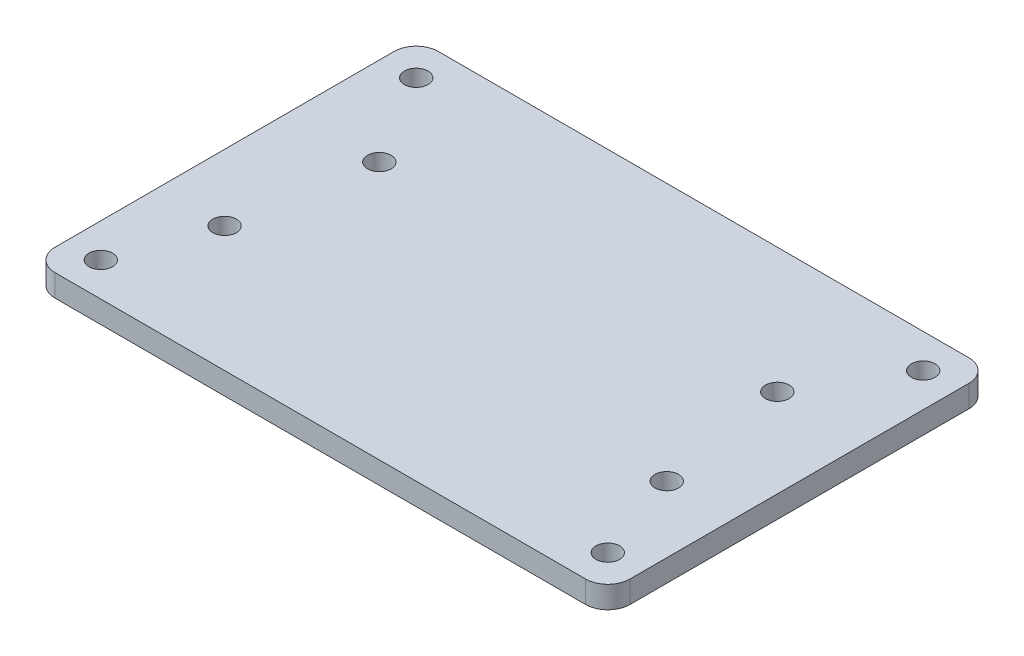
ISO-10303-21;
HEADER;
FILE_DESCRIPTION(('STEP AP214'),'2;1');
FILE_NAME('part.step','',(''),(''),'','','');
FILE_SCHEMA(('AUTOMOTIVE_DESIGN { 1 0 10303 214 1 1 1 1 }'));
ENDSEC;
DATA;
#1=APPLICATION_CONTEXT('core data for automotive mechanical design processes');
#2=APPLICATION_PROTOCOL_DEFINITION('international standard','automotive_design',2000,#1);
#3=PRODUCT_CONTEXT('',#1,'mechanical');
#4=PRODUCT('Part','Part','',(#3));
#5=PRODUCT_RELATED_PRODUCT_CATEGORY('part','',(#4));
#6=PRODUCT_DEFINITION_FORMATION('','',#4);
#7=PRODUCT_DEFINITION_CONTEXT('part definition',#1,'design');
#8=PRODUCT_DEFINITION('design','',#6,#7);
#9=PRODUCT_DEFINITION_SHAPE('','',#8);
#10=(LENGTH_UNIT() NAMED_UNIT(*) SI_UNIT(.MILLI.,.METRE.));
#11=(NAMED_UNIT(*) PLANE_ANGLE_UNIT() SI_UNIT($,.RADIAN.));
#12=(NAMED_UNIT(*) SI_UNIT($,.STERADIAN.) SOLID_ANGLE_UNIT());
#13=UNCERTAINTY_MEASURE_WITH_UNIT(LENGTH_MEASURE(1.E-05),#10,'distance_accuracy_value','');
#14=(GEOMETRIC_REPRESENTATION_CONTEXT(3) GLOBAL_UNCERTAINTY_ASSIGNED_CONTEXT((#13)) GLOBAL_UNIT_ASSIGNED_CONTEXT((#10,
#11,#12)) REPRESENTATION_CONTEXT('',''));
#15=CARTESIAN_POINT('',(0.,0.,0.));
#16=DIRECTION('',(0.,0.,1.));
#17=DIRECTION('',(1.,0.,0.));
#18=AXIS2_PLACEMENT_3D('',#15,#16,#17);
#19=CARTESIAN_POINT('',(39.,3.,26.));
#20=DIRECTION('',(-1.,0.,0.));
#21=DIRECTION('',(0.,0.,1.));
#22=AXIS2_PLACEMENT_3D('',#19,#20,#21);
#23=PLANE('',#22);
#24=DIRECTION('',(0.,0.,-1.));
#25=VECTOR('',#24,1.);
#26=CARTESIAN_POINT('',(39.,3.,26.));
#27=LINE('',#26,#25);
#28=CARTESIAN_POINT('',(39.,3.,23.));
#29=VERTEX_POINT('',#28);
#30=CARTESIAN_POINT('',(39.,3.,-23.));
#31=VERTEX_POINT('',#30);
#32=EDGE_CURVE('E133',#29,#31,#27,.T.);
#33=ORIENTED_EDGE('',*,*,#32,.F.);
#34=DIRECTION('',(0.,-1.,0.));
#35=VECTOR('',#34,1.);
#36=CARTESIAN_POINT('',(39.,3.,23.));
#37=LINE('',#36,#35);
#38=CARTESIAN_POINT('',(39.,0.,23.));
#39=VERTEX_POINT('',#38);
#40=EDGE_CURVE('E11',#29,#39,#37,.T.);
#41=ORIENTED_EDGE('',*,*,#40,.T.);
#42=DIRECTION('',(0.,0.,-1.));
#43=VECTOR('',#42,1.);
#44=CARTESIAN_POINT('',(39.,0.,26.));
#45=LINE('',#44,#43);
#46=CARTESIAN_POINT('',(39.,0.,-23.));
#47=VERTEX_POINT('',#46);
#48=EDGE_CURVE('E135',#39,#47,#45,.T.);
#49=ORIENTED_EDGE('',*,*,#48,.T.);
#50=DIRECTION('',(0.,-1.,0.));
#51=VECTOR('',#50,1.);
#52=CARTESIAN_POINT('',(39.,3.,-23.));
#53=LINE('',#52,#51);
#54=EDGE_CURVE('E46',#47,#31,#53,.F.);
#55=ORIENTED_EDGE('',*,*,#54,.T.);
#56=EDGE_LOOP('',(#33,#41,#49,#55));
#57=FACE_BOUND('',#56,.T.);
#58=ADVANCED_FACE('F38',(#57),#23,.F.);
#59=CARTESIAN_POINT('',(-39.,3.,-26.));
#60=DIRECTION('',(0.,0.,1.));
#61=DIRECTION('',(1.,0.,0.));
#62=AXIS2_PLACEMENT_3D('',#59,#60,#61);
#63=PLANE('',#62);
#64=DIRECTION('',(-1.,0.,0.));
#65=VECTOR('',#64,1.);
#66=CARTESIAN_POINT('',(-39.,0.,-26.));
#67=LINE('',#66,#65);
#68=CARTESIAN_POINT('',(36.,0.,-26.));
#69=VERTEX_POINT('',#68);
#70=CARTESIAN_POINT('',(-36.,0.,-26.));
#71=VERTEX_POINT('',#70);
#72=EDGE_CURVE('E131',#69,#71,#67,.T.);
#73=ORIENTED_EDGE('',*,*,#72,.T.);
#74=DIRECTION('',(0.,-1.,0.));
#75=VECTOR('',#74,1.);
#76=CARTESIAN_POINT('',(-36.,3.,-26.));
#77=LINE('',#76,#75);
#78=CARTESIAN_POINT('',(-36.,3.,-26.));
#79=VERTEX_POINT('',#78);
#80=EDGE_CURVE('E110',#71,#79,#77,.F.);
#81=ORIENTED_EDGE('',*,*,#80,.T.);
#82=DIRECTION('',(-1.,0.,0.));
#83=VECTOR('',#82,1.);
#84=CARTESIAN_POINT('',(-39.,3.,-26.));
#85=LINE('',#84,#83);
#86=CARTESIAN_POINT('',(36.,3.,-26.));
#87=VERTEX_POINT('',#86);
#88=EDGE_CURVE('E171',#87,#79,#85,.T.);
#89=ORIENTED_EDGE('',*,*,#88,.F.);
#90=DIRECTION('',(0.,-1.,0.));
#91=VECTOR('',#90,1.);
#92=CARTESIAN_POINT('',(36.,3.,-26.));
#93=LINE('',#92,#91);
#94=EDGE_CURVE('E115',#87,#69,#93,.T.);
#95=ORIENTED_EDGE('',*,*,#94,.T.);
#96=EDGE_LOOP('',(#73,#81,#89,#95));
#97=FACE_BOUND('',#96,.T.);
#98=ADVANCED_FACE('F175',(#97),#63,.F.);
#99=CARTESIAN_POINT('',(-39.,3.,26.));
#100=DIRECTION('',(1.,0.,0.));
#101=DIRECTION('',(0.,0.,-1.));
#102=AXIS2_PLACEMENT_3D('',#99,#100,#101);
#103=PLANE('',#102);
#104=DIRECTION('',(0.,0.,1.));
#105=VECTOR('',#104,1.);
#106=CARTESIAN_POINT('',(-39.,3.,26.));
#107=LINE('',#106,#105);
#108=CARTESIAN_POINT('',(-39.,3.,-23.));
#109=VERTEX_POINT('',#108);
#110=CARTESIAN_POINT('',(-39.,3.,23.));
#111=VERTEX_POINT('',#110);
#112=EDGE_CURVE('E124',#109,#111,#107,.T.);
#113=ORIENTED_EDGE('',*,*,#112,.F.);
#114=DIRECTION('',(0.,-1.,0.));
#115=VECTOR('',#114,1.);
#116=CARTESIAN_POINT('',(-39.,3.,-23.));
#117=LINE('',#116,#115);
#118=CARTESIAN_POINT('',(-39.,0.,-23.));
#119=VERTEX_POINT('',#118);
#120=EDGE_CURVE('E109',#109,#119,#117,.T.);
#121=ORIENTED_EDGE('',*,*,#120,.T.);
#122=DIRECTION('',(0.,0.,1.));
#123=VECTOR('',#122,1.);
#124=CARTESIAN_POINT('',(-39.,0.,26.));
#125=LINE('',#124,#123);
#126=CARTESIAN_POINT('',(-39.,0.,23.));
#127=VERTEX_POINT('',#126);
#128=EDGE_CURVE('E122',#119,#127,#125,.T.);
#129=ORIENTED_EDGE('',*,*,#128,.T.);
#130=DIRECTION('',(0.,-1.,0.));
#131=VECTOR('',#130,1.);
#132=CARTESIAN_POINT('',(-39.,3.,23.));
#133=LINE('',#132,#131);
#134=EDGE_CURVE('E126',#127,#111,#133,.F.);
#135=ORIENTED_EDGE('',*,*,#134,.T.);
#136=EDGE_LOOP('',(#113,#121,#129,#135));
#137=FACE_BOUND('',#136,.T.);
#138=ADVANCED_FACE('F121',(#137),#103,.F.);
#139=CARTESIAN_POINT('',(-39.,3.,26.));
#140=DIRECTION('',(0.,0.,-1.));
#141=DIRECTION('',(-1.,0.,0.));
#142=AXIS2_PLACEMENT_3D('',#139,#140,#141);
#143=PLANE('',#142);
#144=DIRECTION('',(1.,0.,0.));
#145=VECTOR('',#144,1.);
#146=CARTESIAN_POINT('',(-39.,3.,26.));
#147=LINE('',#146,#145);
#148=CARTESIAN_POINT('',(-36.,3.,26.));
#149=VERTEX_POINT('',#148);
#150=CARTESIAN_POINT('',(36.,3.,26.));
#151=VERTEX_POINT('',#150);
#152=EDGE_CURVE('E139',#149,#151,#147,.T.);
#153=ORIENTED_EDGE('',*,*,#152,.F.);
#154=DIRECTION('',(0.,-1.,0.));
#155=VECTOR('',#154,1.);
#156=CARTESIAN_POINT('',(-36.,3.,26.));
#157=LINE('',#156,#155);
#158=CARTESIAN_POINT('',(-36.,0.,26.));
#159=VERTEX_POINT('',#158);
#160=EDGE_CURVE('E156',#149,#159,#157,.T.);
#161=ORIENTED_EDGE('',*,*,#160,.T.);
#162=DIRECTION('',(1.,0.,0.));
#163=VECTOR('',#162,1.);
#164=CARTESIAN_POINT('',(-39.,0.,26.));
#165=LINE('',#164,#163);
#166=CARTESIAN_POINT('',(36.,0.,26.));
#167=VERTEX_POINT('',#166);
#168=EDGE_CURVE('E130',#159,#167,#165,.T.);
#169=ORIENTED_EDGE('',*,*,#168,.T.);
#170=DIRECTION('',(0.,-1.,0.));
#171=VECTOR('',#170,1.);
#172=CARTESIAN_POINT('',(36.,3.,26.));
#173=LINE('',#172,#171);
#174=EDGE_CURVE('E53',#167,#151,#173,.F.);
#175=ORIENTED_EDGE('',*,*,#174,.T.);
#176=EDGE_LOOP('',(#153,#161,#169,#175));
#177=FACE_BOUND('',#176,.T.);
#178=ADVANCED_FACE('F241',(#177),#143,.F.);
#179=CARTESIAN_POINT('',(0.,3.,0.));
#180=DIRECTION('',(0.,-1.,0.));
#181=DIRECTION('',(0.,0.,-1.));
#182=AXIS2_PLACEMENT_3D('',#179,#180,#181);
#183=PLANE('',#182);
#184=CARTESIAN_POINT('',(-30.,3.,9.00000000000002));
#185=DIRECTION('',(0.,1.,0.));
#186=DIRECTION('',(0.,0.,1.));
#187=AXIS2_PLACEMENT_3D('',#184,#185,#186);
#188=CIRCLE('',#187,1.6);
#189=CARTESIAN_POINT('',(-30.,3.,10.6));
#190=VERTEX_POINT('',#189);
#191=EDGE_CURVE('E211',#190,#190,#188,.T.);
#192=ORIENTED_EDGE('',*,*,#191,.F.);
#193=EDGE_LOOP('',(#192));
#194=FACE_BOUND('',#193,.T.);
#195=CARTESIAN_POINT('',(30.,3.,9.));
#196=DIRECTION('',(0.,1.,0.));
#197=DIRECTION('',(0.,0.,1.));
#198=AXIS2_PLACEMENT_3D('',#195,#196,#197);
#199=CIRCLE('',#198,1.6);
#200=CARTESIAN_POINT('',(30.,3.,10.6));
#201=VERTEX_POINT('',#200);
#202=EDGE_CURVE('E217',#201,#201,#199,.T.);
#203=ORIENTED_EDGE('',*,*,#202,.F.);
#204=EDGE_LOOP('',(#203));
#205=FACE_BOUND('',#204,.T.);
#206=CARTESIAN_POINT('',(27.,3.,-8.99999999999999));
#207=DIRECTION('',(0.,1.,0.));
#208=DIRECTION('',(0.,0.,1.));
#209=AXIS2_PLACEMENT_3D('',#206,#207,#208);
#210=CIRCLE('',#209,1.6);
#211=CARTESIAN_POINT('',(27.,3.,-7.4));
#212=VERTEX_POINT('',#211);
#213=EDGE_CURVE('E223',#212,#212,#210,.T.);
#214=ORIENTED_EDGE('',*,*,#213,.F.);
#215=EDGE_LOOP('',(#214));
#216=FACE_BOUND('',#215,.T.);
#217=CARTESIAN_POINT('',(-27.,3.,-8.99999999999999));
#218=DIRECTION('',(0.,1.,0.));
#219=DIRECTION('',(0.,0.,1.));
#220=AXIS2_PLACEMENT_3D('',#217,#218,#219);
#221=CIRCLE('',#220,1.60000000000001);
#222=CARTESIAN_POINT('',(-27.,3.,-7.39999999999998));
#223=VERTEX_POINT('',#222);
#224=EDGE_CURVE('E205',#223,#223,#221,.T.);
#225=ORIENTED_EDGE('',*,*,#224,.F.);
#226=EDGE_LOOP('',(#225));
#227=FACE_BOUND('',#226,.T.);
#228=CARTESIAN_POINT('',(-34.4,3.,21.4));
#229=DIRECTION('',(0.,1.,0.));
#230=DIRECTION('',(0.,0.,1.));
#231=AXIS2_PLACEMENT_3D('',#228,#229,#230);
#232=CIRCLE('',#231,1.6);
#233=CARTESIAN_POINT('',(-34.4,3.,23.));
#234=VERTEX_POINT('',#233);
#235=EDGE_CURVE('E190',#234,#234,#232,.T.);
#236=ORIENTED_EDGE('',*,*,#235,.F.);
#237=EDGE_LOOP('',(#236));
#238=FACE_BOUND('',#237,.T.);
#239=CARTESIAN_POINT('',(34.4,3.,21.4));
#240=DIRECTION('',(0.,1.,0.));
#241=DIRECTION('',(0.,0.,1.));
#242=AXIS2_PLACEMENT_3D('',#239,#240,#241);
#243=CIRCLE('',#242,1.6);
#244=CARTESIAN_POINT('',(34.4,3.,23.));
#245=VERTEX_POINT('',#244);
#246=EDGE_CURVE('E197',#245,#245,#243,.T.);
#247=ORIENTED_EDGE('',*,*,#246,.F.);
#248=EDGE_LOOP('',(#247));
#249=FACE_BOUND('',#248,.T.);
#250=CARTESIAN_POINT('',(34.4,3.,-21.4));
#251=DIRECTION('',(0.,1.,0.));
#252=DIRECTION('',(0.,0.,1.));
#253=AXIS2_PLACEMENT_3D('',#250,#251,#252);
#254=CIRCLE('',#253,1.6);
#255=CARTESIAN_POINT('',(34.4,3.,-19.8));
#256=VERTEX_POINT('',#255);
#257=EDGE_CURVE('E185',#256,#256,#254,.T.);
#258=ORIENTED_EDGE('',*,*,#257,.F.);
#259=EDGE_LOOP('',(#258));
#260=FACE_BOUND('',#259,.T.);
#261=CARTESIAN_POINT('',(-34.4,3.,-21.4));
#262=DIRECTION('',(0.,1.,0.));
#263=DIRECTION('',(0.,0.,1.));
#264=AXIS2_PLACEMENT_3D('',#261,#262,#263);
#265=CIRCLE('',#264,1.6);
#266=CARTESIAN_POINT('',(-34.4,3.,-19.8));
#267=VERTEX_POINT('',#266);
#268=EDGE_CURVE('E178',#267,#267,#265,.T.);
#269=ORIENTED_EDGE('',*,*,#268,.F.);
#270=EDGE_LOOP('',(#269));
#271=FACE_BOUND('',#270,.T.);
#272=ORIENTED_EDGE('',*,*,#88,.T.);
#273=CARTESIAN_POINT('',(-36.,3.,-23.));
#274=DIRECTION('',(0.,-1.,0.));
#275=DIRECTION('',(0.,0.,-1.));
#276=AXIS2_PLACEMENT_3D('',#273,#274,#275);
#277=CIRCLE('',#276,3.);
#278=EDGE_CURVE('E153',#79,#109,#277,.F.);
#279=ORIENTED_EDGE('',*,*,#278,.T.);
#280=ORIENTED_EDGE('',*,*,#112,.T.);
#281=CARTESIAN_POINT('',(-36.,3.,23.));
#282=DIRECTION('',(0.,-1.,0.));
#283=DIRECTION('',(0.,0.,-1.));
#284=AXIS2_PLACEMENT_3D('',#281,#282,#283);
#285=CIRCLE('',#284,3.);
#286=EDGE_CURVE('E60',#111,#149,#285,.F.);
#287=ORIENTED_EDGE('',*,*,#286,.T.);
#288=ORIENTED_EDGE('',*,*,#152,.T.);
#289=CARTESIAN_POINT('',(36.,3.,23.));
#290=DIRECTION('',(0.,-1.,0.));
#291=DIRECTION('',(0.,0.,-1.));
#292=AXIS2_PLACEMENT_3D('',#289,#290,#291);
#293=CIRCLE('',#292,3.);
#294=EDGE_CURVE('E150',#151,#29,#293,.F.);
#295=ORIENTED_EDGE('',*,*,#294,.T.);
#296=ORIENTED_EDGE('',*,*,#32,.T.);
#297=CARTESIAN_POINT('',(36.,3.,-23.));
#298=DIRECTION('',(0.,-1.,0.));
#299=DIRECTION('',(0.,0.,-1.));
#300=AXIS2_PLACEMENT_3D('',#297,#298,#299);
#301=CIRCLE('',#300,3.);
#302=EDGE_CURVE('E148',#31,#87,#301,.F.);
#303=ORIENTED_EDGE('',*,*,#302,.T.);
#304=EDGE_LOOP('',(#272,#279,#280,#287,#288,#295,#296,#303));
#305=FACE_BOUND('',#304,.T.);
#306=ADVANCED_FACE('F168',(#194,#205,#216,#227,#238,#249,#260,#271,#305),#183,.F.);
#307=CARTESIAN_POINT('',(0.,0.,0.));
#308=DIRECTION('',(0.,-1.,0.));
#309=DIRECTION('',(0.,0.,-1.));
#310=AXIS2_PLACEMENT_3D('',#307,#308,#309);
#311=PLANE('',#310);
#312=CARTESIAN_POINT('',(-30.,0.,9.00000000000002));
#313=DIRECTION('',(0.,1.,0.));
#314=DIRECTION('',(0.,0.,1.));
#315=AXIS2_PLACEMENT_3D('',#312,#313,#314);
#316=CIRCLE('',#315,1.6);
#317=CARTESIAN_POINT('',(-30.,0.,10.6));
#318=VERTEX_POINT('',#317);
#319=EDGE_CURVE('E214',#318,#318,#316,.T.);
#320=ORIENTED_EDGE('',*,*,#319,.T.);
#321=EDGE_LOOP('',(#320));
#322=FACE_BOUND('',#321,.T.);
#323=CARTESIAN_POINT('',(30.,0.,9.));
#324=DIRECTION('',(0.,1.,0.));
#325=DIRECTION('',(0.,0.,1.));
#326=AXIS2_PLACEMENT_3D('',#323,#324,#325);
#327=CIRCLE('',#326,1.6);
#328=CARTESIAN_POINT('',(30.,0.,10.6));
#329=VERTEX_POINT('',#328);
#330=EDGE_CURVE('E220',#329,#329,#327,.T.);
#331=ORIENTED_EDGE('',*,*,#330,.T.);
#332=EDGE_LOOP('',(#331));
#333=FACE_BOUND('',#332,.T.);
#334=CARTESIAN_POINT('',(27.,0.,-8.99999999999999));
#335=DIRECTION('',(0.,1.,0.));
#336=DIRECTION('',(0.,0.,1.));
#337=AXIS2_PLACEMENT_3D('',#334,#335,#336);
#338=CIRCLE('',#337,1.6);
#339=CARTESIAN_POINT('',(27.,0.,-7.4));
#340=VERTEX_POINT('',#339);
#341=EDGE_CURVE('E208',#340,#340,#338,.T.);
#342=ORIENTED_EDGE('',*,*,#341,.T.);
#343=EDGE_LOOP('',(#342));
#344=FACE_BOUND('',#343,.T.);
#345=CARTESIAN_POINT('',(-27.,0.,-8.99999999999999));
#346=DIRECTION('',(0.,1.,0.));
#347=DIRECTION('',(0.,0.,1.));
#348=AXIS2_PLACEMENT_3D('',#345,#346,#347);
#349=CIRCLE('',#348,1.60000000000001);
#350=CARTESIAN_POINT('',(-27.,0.,-7.39999999999998));
#351=VERTEX_POINT('',#350);
#352=EDGE_CURVE('E191',#351,#351,#349,.T.);
#353=ORIENTED_EDGE('',*,*,#352,.T.);
#354=EDGE_LOOP('',(#353));
#355=FACE_BOUND('',#354,.T.);
#356=CARTESIAN_POINT('',(-34.4,0.,21.4));
#357=DIRECTION('',(0.,1.,0.));
#358=DIRECTION('',(0.,0.,1.));
#359=AXIS2_PLACEMENT_3D('',#356,#357,#358);
#360=CIRCLE('',#359,1.6);
#361=CARTESIAN_POINT('',(-34.4,0.,23.));
#362=VERTEX_POINT('',#361);
#363=EDGE_CURVE('E187',#362,#362,#360,.T.);
#364=ORIENTED_EDGE('',*,*,#363,.T.);
#365=EDGE_LOOP('',(#364));
#366=FACE_BOUND('',#365,.T.);
#367=CARTESIAN_POINT('',(34.4,0.,21.4));
#368=DIRECTION('',(0.,1.,0.));
#369=DIRECTION('',(0.,0.,1.));
#370=AXIS2_PLACEMENT_3D('',#367,#368,#369);
#371=CIRCLE('',#370,1.6);
#372=CARTESIAN_POINT('',(34.4,0.,23.));
#373=VERTEX_POINT('',#372);
#374=EDGE_CURVE('E194',#373,#373,#371,.T.);
#375=ORIENTED_EDGE('',*,*,#374,.T.);
#376=EDGE_LOOP('',(#375));
#377=FACE_BOUND('',#376,.T.);
#378=CARTESIAN_POINT('',(34.4,0.,-21.4));
#379=DIRECTION('',(0.,1.,0.));
#380=DIRECTION('',(0.,0.,1.));
#381=AXIS2_PLACEMENT_3D('',#378,#379,#380);
#382=CIRCLE('',#381,1.6);
#383=CARTESIAN_POINT('',(34.4,0.,-19.8));
#384=VERTEX_POINT('',#383);
#385=EDGE_CURVE('E200',#384,#384,#382,.T.);
#386=ORIENTED_EDGE('',*,*,#385,.T.);
#387=EDGE_LOOP('',(#386));
#388=FACE_BOUND('',#387,.T.);
#389=CARTESIAN_POINT('',(-34.4,0.,-21.4));
#390=DIRECTION('',(0.,1.,0.));
#391=DIRECTION('',(0.,0.,1.));
#392=AXIS2_PLACEMENT_3D('',#389,#390,#391);
#393=CIRCLE('',#392,1.6);
#394=CARTESIAN_POINT('',(-34.4,0.,-19.8));
#395=VERTEX_POINT('',#394);
#396=EDGE_CURVE('E176',#395,#395,#393,.T.);
#397=ORIENTED_EDGE('',*,*,#396,.T.);
#398=EDGE_LOOP('',(#397));
#399=FACE_BOUND('',#398,.T.);
#400=ORIENTED_EDGE('',*,*,#128,.F.);
#401=CARTESIAN_POINT('',(-36.,0.,-23.));
#402=DIRECTION('',(0.,-1.,0.));
#403=DIRECTION('',(0.,0.,-1.));
#404=AXIS2_PLACEMENT_3D('',#401,#402,#403);
#405=CIRCLE('',#404,3.);
#406=EDGE_CURVE('E105',#119,#71,#405,.T.);
#407=ORIENTED_EDGE('',*,*,#406,.T.);
#408=ORIENTED_EDGE('',*,*,#72,.F.);
#409=CARTESIAN_POINT('',(36.,0.,-23.));
#410=DIRECTION('',(0.,-1.,0.));
#411=DIRECTION('',(0.,0.,-1.));
#412=AXIS2_PLACEMENT_3D('',#409,#410,#411);
#413=CIRCLE('',#412,3.);
#414=EDGE_CURVE('E125',#69,#47,#413,.T.);
#415=ORIENTED_EDGE('',*,*,#414,.T.);
#416=ORIENTED_EDGE('',*,*,#48,.F.);
#417=CARTESIAN_POINT('',(36.,0.,23.));
#418=DIRECTION('',(0.,-1.,0.));
#419=DIRECTION('',(0.,0.,-1.));
#420=AXIS2_PLACEMENT_3D('',#417,#418,#419);
#421=CIRCLE('',#420,3.);
#422=EDGE_CURVE('E142',#39,#167,#421,.T.);
#423=ORIENTED_EDGE('',*,*,#422,.T.);
#424=ORIENTED_EDGE('',*,*,#168,.F.);
#425=CARTESIAN_POINT('',(-36.,0.,23.));
#426=DIRECTION('',(0.,-1.,0.));
#427=DIRECTION('',(0.,0.,-1.));
#428=AXIS2_PLACEMENT_3D('',#425,#426,#427);
#429=CIRCLE('',#428,3.);
#430=EDGE_CURVE('E116',#159,#127,#429,.T.);
#431=ORIENTED_EDGE('',*,*,#430,.T.);
#432=EDGE_LOOP('',(#400,#407,#408,#415,#416,#423,#424,#431));
#433=FACE_BOUND('',#432,.T.);
#434=ADVANCED_FACE('F128',(#322,#333,#344,#355,#366,#377,#388,#399,#433),#311,.T.);
#435=CARTESIAN_POINT('',(-34.4,0.,-21.4));
#436=DIRECTION('',(0.,1.,0.));
#437=DIRECTION('',(0.,0.,1.));
#438=AXIS2_PLACEMENT_3D('',#435,#436,#437);
#439=CYLINDRICAL_SURFACE('',#438,1.6);
#440=ORIENTED_EDGE('',*,*,#396,.F.);
#441=EDGE_LOOP('',(#440));
#442=FACE_BOUND('',#441,.T.);
#443=ORIENTED_EDGE('',*,*,#268,.T.);
#444=EDGE_LOOP('',(#443));
#445=FACE_BOUND('',#444,.T.);
#446=ADVANCED_FACE('F254',(#442,#445),#439,.F.);
#447=CARTESIAN_POINT('',(34.4,0.,-21.4));
#448=DIRECTION('',(0.,1.,0.));
#449=DIRECTION('',(0.,0.,1.));
#450=AXIS2_PLACEMENT_3D('',#447,#448,#449);
#451=CYLINDRICAL_SURFACE('',#450,1.6);
#452=ORIENTED_EDGE('',*,*,#385,.F.);
#453=EDGE_LOOP('',(#452));
#454=FACE_BOUND('',#453,.T.);
#455=ORIENTED_EDGE('',*,*,#257,.T.);
#456=EDGE_LOOP('',(#455));
#457=FACE_BOUND('',#456,.T.);
#458=ADVANCED_FACE('F256',(#454,#457),#451,.F.);
#459=CARTESIAN_POINT('',(34.4,0.,21.4));
#460=DIRECTION('',(0.,1.,0.));
#461=DIRECTION('',(0.,0.,1.));
#462=AXIS2_PLACEMENT_3D('',#459,#460,#461);
#463=CYLINDRICAL_SURFACE('',#462,1.6);
#464=ORIENTED_EDGE('',*,*,#374,.F.);
#465=EDGE_LOOP('',(#464));
#466=FACE_BOUND('',#465,.T.);
#467=ORIENTED_EDGE('',*,*,#246,.T.);
#468=EDGE_LOOP('',(#467));
#469=FACE_BOUND('',#468,.T.);
#470=ADVANCED_FACE('F263',(#466,#469),#463,.F.);
#471=CARTESIAN_POINT('',(-34.4,0.,21.4));
#472=DIRECTION('',(0.,1.,0.));
#473=DIRECTION('',(0.,0.,1.));
#474=AXIS2_PLACEMENT_3D('',#471,#472,#473);
#475=CYLINDRICAL_SURFACE('',#474,1.6);
#476=ORIENTED_EDGE('',*,*,#363,.F.);
#477=EDGE_LOOP('',(#476));
#478=FACE_BOUND('',#477,.T.);
#479=ORIENTED_EDGE('',*,*,#235,.T.);
#480=EDGE_LOOP('',(#479));
#481=FACE_BOUND('',#480,.T.);
#482=ADVANCED_FACE('F392',(#478,#481),#475,.F.);
#483=CARTESIAN_POINT('',(-27.,0.,-8.99999999999999));
#484=DIRECTION('',(0.,1.,0.));
#485=DIRECTION('',(0.,0.,1.));
#486=AXIS2_PLACEMENT_3D('',#483,#484,#485);
#487=CYLINDRICAL_SURFACE('',#486,1.60000000000001);
#488=ORIENTED_EDGE('',*,*,#352,.F.);
#489=EDGE_LOOP('',(#488));
#490=FACE_BOUND('',#489,.T.);
#491=ORIENTED_EDGE('',*,*,#224,.T.);
#492=EDGE_LOOP('',(#491));
#493=FACE_BOUND('',#492,.T.);
#494=ADVANCED_FACE('F235',(#490,#493),#487,.F.);
#495=CARTESIAN_POINT('',(27.,0.,-8.99999999999999));
#496=DIRECTION('',(0.,1.,0.));
#497=DIRECTION('',(0.,0.,1.));
#498=AXIS2_PLACEMENT_3D('',#495,#496,#497);
#499=CYLINDRICAL_SURFACE('',#498,1.6);
#500=ORIENTED_EDGE('',*,*,#341,.F.);
#501=EDGE_LOOP('',(#500));
#502=FACE_BOUND('',#501,.T.);
#503=ORIENTED_EDGE('',*,*,#213,.T.);
#504=EDGE_LOOP('',(#503));
#505=FACE_BOUND('',#504,.T.);
#506=ADVANCED_FACE('F231',(#502,#505),#499,.F.);
#507=CARTESIAN_POINT('',(30.,0.,9.));
#508=DIRECTION('',(0.,1.,0.));
#509=DIRECTION('',(0.,0.,1.));
#510=AXIS2_PLACEMENT_3D('',#507,#508,#509);
#511=CYLINDRICAL_SURFACE('',#510,1.6);
#512=ORIENTED_EDGE('',*,*,#330,.F.);
#513=EDGE_LOOP('',(#512));
#514=FACE_BOUND('',#513,.T.);
#515=ORIENTED_EDGE('',*,*,#202,.T.);
#516=EDGE_LOOP('',(#515));
#517=FACE_BOUND('',#516,.T.);
#518=ADVANCED_FACE('F234',(#514,#517),#511,.F.);
#519=CARTESIAN_POINT('',(-30.,0.,9.00000000000002));
#520=DIRECTION('',(0.,1.,0.));
#521=DIRECTION('',(0.,0.,1.));
#522=AXIS2_PLACEMENT_3D('',#519,#520,#521);
#523=CYLINDRICAL_SURFACE('',#522,1.6);
#524=ORIENTED_EDGE('',*,*,#319,.F.);
#525=EDGE_LOOP('',(#524));
#526=FACE_BOUND('',#525,.T.);
#527=ORIENTED_EDGE('',*,*,#191,.T.);
#528=EDGE_LOOP('',(#527));
#529=FACE_BOUND('',#528,.T.);
#530=ADVANCED_FACE('F281',(#526,#529),#523,.F.);
#531=CARTESIAN_POINT('',(-36.,3.,-23.));
#532=DIRECTION('',(0.,-1.,0.));
#533=DIRECTION('',(0.,0.,-1.));
#534=AXIS2_PLACEMENT_3D('',#531,#532,#533);
#535=CYLINDRICAL_SURFACE('',#534,3.);
#536=ORIENTED_EDGE('',*,*,#278,.F.);
#537=ORIENTED_EDGE('',*,*,#80,.F.);
#538=ORIENTED_EDGE('',*,*,#406,.F.);
#539=ORIENTED_EDGE('',*,*,#120,.F.);
#540=EDGE_LOOP('',(#536,#537,#538,#539));
#541=FACE_BOUND('',#540,.T.);
#542=ADVANCED_FACE('F108',(#541),#535,.T.);
#543=CARTESIAN_POINT('',(-36.,3.,23.));
#544=DIRECTION('',(0.,-1.,0.));
#545=DIRECTION('',(0.,0.,-1.));
#546=AXIS2_PLACEMENT_3D('',#543,#544,#545);
#547=CYLINDRICAL_SURFACE('',#546,3.);
#548=ORIENTED_EDGE('',*,*,#286,.F.);
#549=ORIENTED_EDGE('',*,*,#134,.F.);
#550=ORIENTED_EDGE('',*,*,#430,.F.);
#551=ORIENTED_EDGE('',*,*,#160,.F.);
#552=EDGE_LOOP('',(#548,#549,#550,#551));
#553=FACE_BOUND('',#552,.T.);
#554=ADVANCED_FACE('F280',(#553),#547,.T.);
#555=CARTESIAN_POINT('',(36.,3.,23.));
#556=DIRECTION('',(0.,-1.,0.));
#557=DIRECTION('',(0.,0.,-1.));
#558=AXIS2_PLACEMENT_3D('',#555,#556,#557);
#559=CYLINDRICAL_SURFACE('',#558,3.);
#560=ORIENTED_EDGE('',*,*,#294,.F.);
#561=ORIENTED_EDGE('',*,*,#174,.F.);
#562=ORIENTED_EDGE('',*,*,#422,.F.);
#563=ORIENTED_EDGE('',*,*,#40,.F.);
#564=EDGE_LOOP('',(#560,#561,#562,#563));
#565=FACE_BOUND('',#564,.T.);
#566=ADVANCED_FACE('F283',(#565),#559,.T.);
#567=CARTESIAN_POINT('',(36.,3.,-23.));
#568=DIRECTION('',(0.,-1.,0.));
#569=DIRECTION('',(0.,0.,-1.));
#570=AXIS2_PLACEMENT_3D('',#567,#568,#569);
#571=CYLINDRICAL_SURFACE('',#570,3.);
#572=ORIENTED_EDGE('',*,*,#302,.F.);
#573=ORIENTED_EDGE('',*,*,#54,.F.);
#574=ORIENTED_EDGE('',*,*,#414,.F.);
#575=ORIENTED_EDGE('',*,*,#94,.F.);
#576=EDGE_LOOP('',(#572,#573,#574,#575));
#577=FACE_BOUND('',#576,.T.);
#578=ADVANCED_FACE('F40',(#577),#571,.T.);
#579=CLOSED_SHELL('',(#58,#98,#138,#178,#306,#434,#446,#458,#470,#482,#494,#506,#518,#530,#542,
#554,#566,#578));
#580=MANIFOLD_SOLID_BREP('B2',#579);
#581=ADVANCED_BREP_SHAPE_REPRESENTATION('',(#18,#580),#14);
#582=SHAPE_DEFINITION_REPRESENTATION(#9,#581);
ENDSEC;
END-ISO-10303-21;
